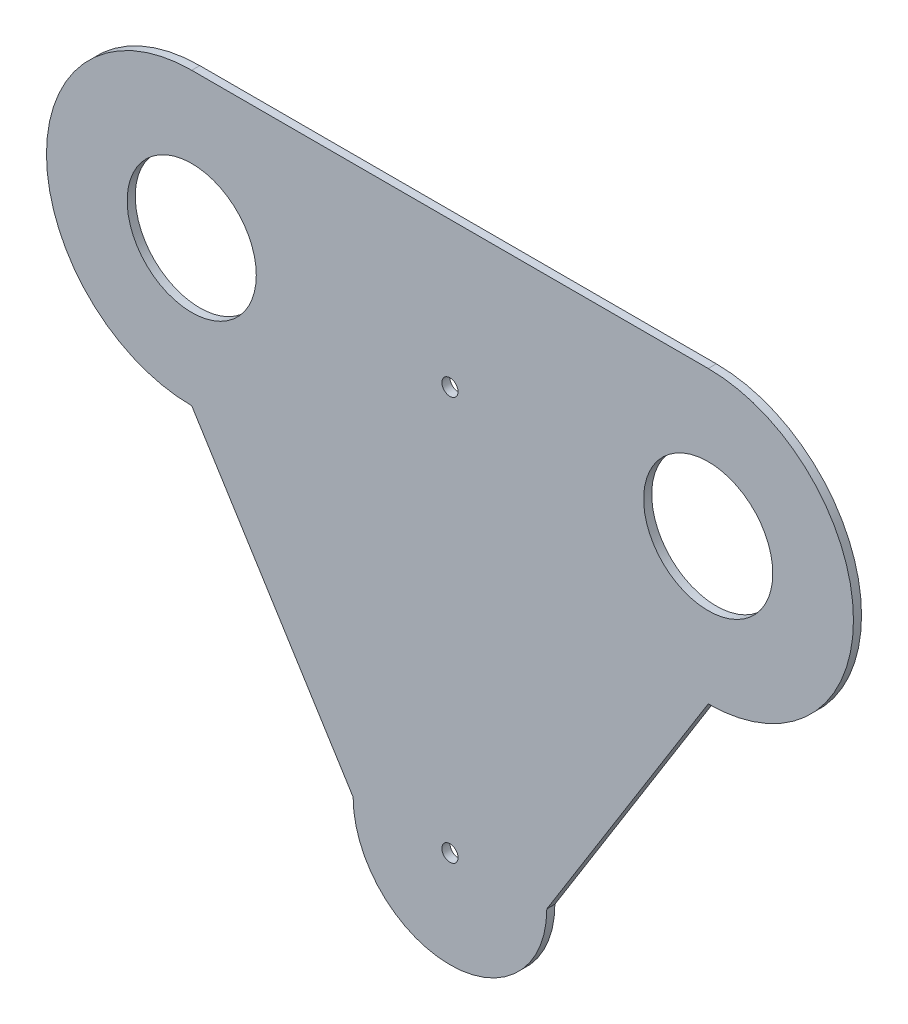
ISO-10303-21;
HEADER;
FILE_DESCRIPTION(('STEP AP214'),'2;1');
FILE_NAME('part.step','',(''),(''),'','','');
FILE_SCHEMA(('AUTOMOTIVE_DESIGN { 1 0 10303 214 1 1 1 1 }'));
ENDSEC;
DATA;
#1=APPLICATION_CONTEXT('core data for automotive mechanical design processes');
#2=APPLICATION_PROTOCOL_DEFINITION('international standard','automotive_design',2000,#1);
#3=PRODUCT_CONTEXT('',#1,'mechanical');
#4=PRODUCT('Part','Part','',(#3));
#5=PRODUCT_RELATED_PRODUCT_CATEGORY('part','',(#4));
#6=PRODUCT_DEFINITION_FORMATION('','',#4);
#7=PRODUCT_DEFINITION_CONTEXT('part definition',#1,'design');
#8=PRODUCT_DEFINITION('design','',#6,#7);
#9=PRODUCT_DEFINITION_SHAPE('','',#8);
#10=(LENGTH_UNIT() NAMED_UNIT(*) SI_UNIT(.MILLI.,.METRE.));
#11=(NAMED_UNIT(*) PLANE_ANGLE_UNIT() SI_UNIT($,.RADIAN.));
#12=(NAMED_UNIT(*) SI_UNIT($,.STERADIAN.) SOLID_ANGLE_UNIT());
#13=UNCERTAINTY_MEASURE_WITH_UNIT(LENGTH_MEASURE(1.E-05),#10,'distance_accuracy_value','');
#14=(GEOMETRIC_REPRESENTATION_CONTEXT(3) GLOBAL_UNCERTAINTY_ASSIGNED_CONTEXT((#13)) GLOBAL_UNIT_ASSIGNED_CONTEXT((#10,
#11,#12)) REPRESENTATION_CONTEXT('',''));
#15=CARTESIAN_POINT('',(0.,0.,0.));
#16=DIRECTION('',(0.,0.,1.));
#17=DIRECTION('',(1.,0.,0.));
#18=AXIS2_PLACEMENT_3D('',#15,#16,#17);
#19=CARTESIAN_POINT('',(0.,-125.,2.5));
#20=DIRECTION('',(0.,0.,-1.));
#21=DIRECTION('',(-1.,0.,0.));
#22=AXIS2_PLACEMENT_3D('',#19,#20,#21);
#23=CYLINDRICAL_SURFACE('',#22,30.);
#24=CARTESIAN_POINT('',(0.,-125.,0.));
#25=DIRECTION('',(0.,0.,1.));
#26=DIRECTION('',(1.,0.,0.));
#27=AXIS2_PLACEMENT_3D('',#24,#25,#26);
#28=CIRCLE('',#27,30.);
#29=CARTESIAN_POINT('',(-30.,-125.,0.));
#30=VERTEX_POINT('',#29);
#31=CARTESIAN_POINT('',(30.0000000000001,-125.,0.));
#32=VERTEX_POINT('',#31);
#33=EDGE_CURVE('E136',#30,#32,#28,.T.);
#34=ORIENTED_EDGE('',*,*,#33,.T.);
#35=DIRECTION('',(0.,0.,-1.));
#36=VECTOR('',#35,1.);
#37=CARTESIAN_POINT('',(30.0000000000001,-125.,2.5));
#38=LINE('',#37,#36);
#39=CARTESIAN_POINT('',(30.0000000000001,-125.,2.5));
#40=VERTEX_POINT('',#39);
#41=EDGE_CURVE('E11',#40,#32,#38,.T.);
#42=ORIENTED_EDGE('',*,*,#41,.F.);
#43=CARTESIAN_POINT('',(0.,-125.,2.5));
#44=DIRECTION('',(0.,0.,1.));
#45=DIRECTION('',(1.,0.,0.));
#46=AXIS2_PLACEMENT_3D('',#43,#44,#45);
#47=CIRCLE('',#46,30.);
#48=CARTESIAN_POINT('',(-30.,-125.,2.5));
#49=VERTEX_POINT('',#48);
#50=EDGE_CURVE('E160',#49,#40,#47,.T.);
#51=ORIENTED_EDGE('',*,*,#50,.F.);
#52=DIRECTION('',(0.,0.,-1.));
#53=VECTOR('',#52,1.);
#54=CARTESIAN_POINT('',(-30.,-125.,2.5));
#55=LINE('',#54,#53);
#56=EDGE_CURVE('E135',#49,#30,#55,.T.);
#57=ORIENTED_EDGE('',*,*,#56,.T.);
#58=EDGE_LOOP('',(#34,#42,#51,#57));
#59=FACE_BOUND('',#58,.T.);
#60=ADVANCED_FACE('F41',(#59),#23,.T.);
#61=CARTESIAN_POINT('',(77.7528089887641,-48.5955056179775,2.5));
#62=DIRECTION('',(-0.847998304005088,0.52999894000318,0.));
#63=DIRECTION('',(-0.52999894000318,-0.847998304005088,0.));
#64=AXIS2_PLACEMENT_3D('',#61,#62,#63);
#65=PLANE('',#64);
#66=DIRECTION('',(0.52999894000318,0.847998304005088,0.));
#67=VECTOR('',#66,1.);
#68=CARTESIAN_POINT('',(77.7528089887641,-48.5955056179775,0.));
#69=LINE('',#68,#67);
#70=CARTESIAN_POINT('',(80.,-45.,0.));
#71=VERTEX_POINT('',#70);
#72=EDGE_CURVE('E139',#32,#71,#69,.T.);
#73=ORIENTED_EDGE('',*,*,#72,.T.);
#74=DIRECTION('',(0.,0.,-1.));
#75=VECTOR('',#74,1.);
#76=CARTESIAN_POINT('',(80.,-45.,2.5));
#77=LINE('',#76,#75);
#78=CARTESIAN_POINT('',(80.,-45.,2.5));
#79=VERTEX_POINT('',#78);
#80=EDGE_CURVE('E49',#79,#71,#77,.T.);
#81=ORIENTED_EDGE('',*,*,#80,.F.);
#82=DIRECTION('',(0.52999894000318,0.847998304005088,0.));
#83=VECTOR('',#82,1.);
#84=CARTESIAN_POINT('',(77.7528089887641,-48.5955056179775,2.5));
#85=LINE('',#84,#83);
#86=EDGE_CURVE('E90',#40,#79,#85,.T.);
#87=ORIENTED_EDGE('',*,*,#86,.F.);
#88=ORIENTED_EDGE('',*,*,#41,.T.);
#89=EDGE_LOOP('',(#73,#81,#87,#88));
#90=FACE_BOUND('',#89,.T.);
#91=ADVANCED_FACE('F190',(#90),#65,.F.);
#92=CARTESIAN_POINT('',(80.,0.,2.5));
#93=DIRECTION('',(0.,0.,-1.));
#94=DIRECTION('',(-1.,0.,0.));
#95=AXIS2_PLACEMENT_3D('',#92,#93,#94);
#96=CYLINDRICAL_SURFACE('',#95,45.);
#97=CARTESIAN_POINT('',(80.,0.,0.));
#98=DIRECTION('',(0.,0.,1.));
#99=DIRECTION('',(1.,0.,0.));
#100=AXIS2_PLACEMENT_3D('',#97,#98,#99);
#101=CIRCLE('',#100,45.);
#102=CARTESIAN_POINT('',(80.,45.0000000000001,0.));
#103=VERTEX_POINT('',#102);
#104=EDGE_CURVE('E141',#71,#103,#101,.T.);
#105=ORIENTED_EDGE('',*,*,#104,.T.);
#106=DIRECTION('',(0.,0.,-1.));
#107=VECTOR('',#106,1.);
#108=CARTESIAN_POINT('',(80.,45.0000000000001,2.5));
#109=LINE('',#108,#107);
#110=CARTESIAN_POINT('',(80.,45.0000000000001,2.5));
#111=VERTEX_POINT('',#110);
#112=EDGE_CURVE('E109',#111,#103,#109,.T.);
#113=ORIENTED_EDGE('',*,*,#112,.F.);
#114=CARTESIAN_POINT('',(80.,0.,2.5));
#115=DIRECTION('',(0.,0.,1.));
#116=DIRECTION('',(1.,0.,0.));
#117=AXIS2_PLACEMENT_3D('',#114,#115,#116);
#118=CIRCLE('',#117,45.);
#119=EDGE_CURVE('E115',#79,#111,#118,.T.);
#120=ORIENTED_EDGE('',*,*,#119,.F.);
#121=ORIENTED_EDGE('',*,*,#80,.T.);
#122=EDGE_LOOP('',(#105,#113,#120,#121));
#123=FACE_BOUND('',#122,.T.);
#124=ADVANCED_FACE('F166',(#123),#96,.T.);
#125=CARTESIAN_POINT('',(0.,45.,2.5));
#126=DIRECTION('',(0.,1.,0.));
#127=DIRECTION('',(-1.,0.,0.));
#128=AXIS2_PLACEMENT_3D('',#125,#126,#127);
#129=PLANE('',#128);
#130=DIRECTION('',(1.,0.,0.));
#131=VECTOR('',#130,1.);
#132=CARTESIAN_POINT('',(0.,45.,0.));
#133=LINE('',#132,#131);
#134=CARTESIAN_POINT('',(-80.,45.,0.));
#135=VERTEX_POINT('',#134);
#136=EDGE_CURVE('E104',#135,#103,#133,.T.);
#137=ORIENTED_EDGE('',*,*,#136,.F.);
#138=DIRECTION('',(0.,0.,-1.));
#139=VECTOR('',#138,1.);
#140=CARTESIAN_POINT('',(-80.,45.,2.5));
#141=LINE('',#140,#139);
#142=CARTESIAN_POINT('',(-80.,45.,2.5));
#143=VERTEX_POINT('',#142);
#144=EDGE_CURVE('E99',#143,#135,#141,.T.);
#145=ORIENTED_EDGE('',*,*,#144,.F.);
#146=DIRECTION('',(1.,0.,0.));
#147=VECTOR('',#146,1.);
#148=CARTESIAN_POINT('',(0.,45.,2.5));
#149=LINE('',#148,#147);
#150=EDGE_CURVE('E102',#143,#111,#149,.T.);
#151=ORIENTED_EDGE('',*,*,#150,.T.);
#152=ORIENTED_EDGE('',*,*,#112,.T.);
#153=EDGE_LOOP('',(#137,#145,#151,#152));
#154=FACE_BOUND('',#153,.T.);
#155=ADVANCED_FACE('F101',(#154),#129,.T.);
#156=CARTESIAN_POINT('',(-80.,0.,2.5));
#157=DIRECTION('',(0.,0.,-1.));
#158=DIRECTION('',(-1.,0.,0.));
#159=AXIS2_PLACEMENT_3D('',#156,#157,#158);
#160=CYLINDRICAL_SURFACE('',#159,45.);
#161=CARTESIAN_POINT('',(-80.,0.,0.));
#162=DIRECTION('',(0.,0.,1.));
#163=DIRECTION('',(1.,0.,0.));
#164=AXIS2_PLACEMENT_3D('',#161,#162,#163);
#165=CIRCLE('',#164,45.);
#166=CARTESIAN_POINT('',(-80.,-45.,0.));
#167=VERTEX_POINT('',#166);
#168=EDGE_CURVE('E145',#167,#135,#165,.F.);
#169=ORIENTED_EDGE('',*,*,#168,.F.);
#170=DIRECTION('',(0.,0.,-1.));
#171=VECTOR('',#170,1.);
#172=CARTESIAN_POINT('',(-80.,-45.,2.5));
#173=LINE('',#172,#171);
#174=CARTESIAN_POINT('',(-80.,-45.,2.5));
#175=VERTEX_POINT('',#174);
#176=EDGE_CURVE('E79',#175,#167,#173,.T.);
#177=ORIENTED_EDGE('',*,*,#176,.F.);
#178=CARTESIAN_POINT('',(-80.,0.,2.5));
#179=DIRECTION('',(0.,0.,1.));
#180=DIRECTION('',(1.,0.,0.));
#181=AXIS2_PLACEMENT_3D('',#178,#179,#180);
#182=CIRCLE('',#181,45.);
#183=EDGE_CURVE('E113',#175,#143,#182,.F.);
#184=ORIENTED_EDGE('',*,*,#183,.T.);
#185=ORIENTED_EDGE('',*,*,#144,.T.);
#186=EDGE_LOOP('',(#169,#177,#184,#185));
#187=FACE_BOUND('',#186,.T.);
#188=ADVANCED_FACE('F118',(#187),#160,.T.);
#189=CARTESIAN_POINT('',(80.,0.,2.5));
#190=DIRECTION('',(0.,0.,-1.));
#191=DIRECTION('',(-1.,0.,0.));
#192=AXIS2_PLACEMENT_3D('',#189,#190,#191);
#193=CYLINDRICAL_SURFACE('',#192,20.);
#194=CARTESIAN_POINT('',(80.,0.,2.5));
#195=DIRECTION('',(0.,0.,1.));
#196=DIRECTION('',(1.,0.,0.));
#197=AXIS2_PLACEMENT_3D('',#194,#195,#196);
#198=CIRCLE('',#197,20.);
#199=CARTESIAN_POINT('',(100.,0.,2.5));
#200=VERTEX_POINT('',#199);
#201=EDGE_CURVE('E129',#200,#200,#198,.T.);
#202=ORIENTED_EDGE('',*,*,#201,.T.);
#203=EDGE_LOOP('',(#202));
#204=FACE_BOUND('',#203,.T.);
#205=CARTESIAN_POINT('',(80.,0.,0.));
#206=DIRECTION('',(0.,0.,1.));
#207=DIRECTION('',(1.,0.,0.));
#208=AXIS2_PLACEMENT_3D('',#205,#206,#207);
#209=CIRCLE('',#208,20.);
#210=CARTESIAN_POINT('',(100.,0.,0.));
#211=VERTEX_POINT('',#210);
#212=EDGE_CURVE('E154',#211,#211,#209,.T.);
#213=ORIENTED_EDGE('',*,*,#212,.F.);
#214=EDGE_LOOP('',(#213));
#215=FACE_BOUND('',#214,.T.);
#216=ADVANCED_FACE('F201',(#204,#215),#193,.F.);
#217=CARTESIAN_POINT('',(0.,0.,2.5));
#218=DIRECTION('',(0.,0.,-1.));
#219=DIRECTION('',(-1.,0.,0.));
#220=AXIS2_PLACEMENT_3D('',#217,#218,#219);
#221=CYLINDRICAL_SURFACE('',#220,2.5);
#222=CARTESIAN_POINT('',(0.,0.,2.5));
#223=DIRECTION('',(0.,0.,1.));
#224=DIRECTION('',(1.,0.,0.));
#225=AXIS2_PLACEMENT_3D('',#222,#223,#224);
#226=CIRCLE('',#225,2.5);
#227=CARTESIAN_POINT('',(2.5,0.,2.5));
#228=VERTEX_POINT('',#227);
#229=EDGE_CURVE('E126',#228,#228,#226,.T.);
#230=ORIENTED_EDGE('',*,*,#229,.T.);
#231=EDGE_LOOP('',(#230));
#232=FACE_BOUND('',#231,.T.);
#233=CARTESIAN_POINT('',(0.,0.,0.));
#234=DIRECTION('',(0.,0.,1.));
#235=DIRECTION('',(1.,0.,0.));
#236=AXIS2_PLACEMENT_3D('',#233,#234,#235);
#237=CIRCLE('',#236,2.5);
#238=CARTESIAN_POINT('',(2.5,0.,0.));
#239=VERTEX_POINT('',#238);
#240=EDGE_CURVE('E151',#239,#239,#237,.T.);
#241=ORIENTED_EDGE('',*,*,#240,.F.);
#242=EDGE_LOOP('',(#241));
#243=FACE_BOUND('',#242,.T.);
#244=ADVANCED_FACE('F185',(#232,#243),#221,.F.);
#245=CARTESIAN_POINT('',(0.,-125.,2.5));
#246=DIRECTION('',(0.,0.,-1.));
#247=DIRECTION('',(-1.,0.,0.));
#248=AXIS2_PLACEMENT_3D('',#245,#246,#247);
#249=CYLINDRICAL_SURFACE('',#248,2.5);
#250=CARTESIAN_POINT('',(0.,-125.,2.5));
#251=DIRECTION('',(0.,0.,1.));
#252=DIRECTION('',(1.,0.,0.));
#253=AXIS2_PLACEMENT_3D('',#250,#251,#252);
#254=CIRCLE('',#253,2.5);
#255=CARTESIAN_POINT('',(2.50000000000002,-125.,2.5));
#256=VERTEX_POINT('',#255);
#257=EDGE_CURVE('E120',#256,#256,#254,.T.);
#258=ORIENTED_EDGE('',*,*,#257,.T.);
#259=EDGE_LOOP('',(#258));
#260=FACE_BOUND('',#259,.T.);
#261=CARTESIAN_POINT('',(0.,-125.,0.));
#262=DIRECTION('',(0.,0.,1.));
#263=DIRECTION('',(1.,0.,0.));
#264=AXIS2_PLACEMENT_3D('',#261,#262,#263);
#265=CIRCLE('',#264,2.5);
#266=CARTESIAN_POINT('',(2.50000000000002,-125.,0.));
#267=VERTEX_POINT('',#266);
#268=EDGE_CURVE('E148',#267,#267,#265,.T.);
#269=ORIENTED_EDGE('',*,*,#268,.F.);
#270=EDGE_LOOP('',(#269));
#271=FACE_BOUND('',#270,.T.);
#272=ADVANCED_FACE('F177',(#260,#271),#249,.F.);
#273=CARTESIAN_POINT('',(-77.752808988764,-48.5955056179775,2.5));
#274=DIRECTION('',(0.847998304005088,0.52999894000318,0.));
#275=DIRECTION('',(-0.52999894000318,0.847998304005088,0.));
#276=AXIS2_PLACEMENT_3D('',#273,#274,#275);
#277=PLANE('',#276);
#278=DIRECTION('',(0.52999894000318,-0.847998304005088,0.));
#279=VECTOR('',#278,1.);
#280=CARTESIAN_POINT('',(-77.752808988764,-48.5955056179775,0.));
#281=LINE('',#280,#279);
#282=EDGE_CURVE('E82',#167,#30,#281,.T.);
#283=ORIENTED_EDGE('',*,*,#282,.T.);
#284=ORIENTED_EDGE('',*,*,#56,.F.);
#285=DIRECTION('',(0.52999894000318,-0.847998304005088,0.));
#286=VECTOR('',#285,1.);
#287=CARTESIAN_POINT('',(-77.752808988764,-48.5955056179775,2.5));
#288=LINE('',#287,#286);
#289=EDGE_CURVE('E57',#175,#49,#288,.T.);
#290=ORIENTED_EDGE('',*,*,#289,.F.);
#291=ORIENTED_EDGE('',*,*,#176,.T.);
#292=EDGE_LOOP('',(#283,#284,#290,#291));
#293=FACE_BOUND('',#292,.T.);
#294=ADVANCED_FACE('F174',(#293),#277,.F.);
#295=CARTESIAN_POINT('',(-80.,0.,2.5));
#296=DIRECTION('',(0.,0.,-1.));
#297=DIRECTION('',(-1.,0.,0.));
#298=AXIS2_PLACEMENT_3D('',#295,#296,#297);
#299=CYLINDRICAL_SURFACE('',#298,20.);
#300=CARTESIAN_POINT('',(-80.,0.,2.5));
#301=DIRECTION('',(0.,0.,1.));
#302=DIRECTION('',(1.,0.,0.));
#303=AXIS2_PLACEMENT_3D('',#300,#301,#302);
#304=CIRCLE('',#303,20.);
#305=CARTESIAN_POINT('',(-60.,0.,2.5));
#306=VERTEX_POINT('',#305);
#307=EDGE_CURVE('E132',#306,#306,#304,.T.);
#308=ORIENTED_EDGE('',*,*,#307,.T.);
#309=EDGE_LOOP('',(#308));
#310=FACE_BOUND('',#309,.T.);
#311=CARTESIAN_POINT('',(-80.,0.,0.));
#312=DIRECTION('',(0.,0.,1.));
#313=DIRECTION('',(1.,0.,0.));
#314=AXIS2_PLACEMENT_3D('',#311,#312,#313);
#315=CIRCLE('',#314,20.);
#316=CARTESIAN_POINT('',(-60.,0.,0.));
#317=VERTEX_POINT('',#316);
#318=EDGE_CURVE('E157',#317,#317,#315,.T.);
#319=ORIENTED_EDGE('',*,*,#318,.F.);
#320=EDGE_LOOP('',(#319));
#321=FACE_BOUND('',#320,.T.);
#322=ADVANCED_FACE('F176',(#310,#321),#299,.F.);
#323=CARTESIAN_POINT('',(0.,0.,2.5));
#324=DIRECTION('',(0.,0.,1.));
#325=DIRECTION('',(1.,0.,0.));
#326=AXIS2_PLACEMENT_3D('',#323,#324,#325);
#327=PLANE('',#326);
#328=ORIENTED_EDGE('',*,*,#50,.T.);
#329=ORIENTED_EDGE('',*,*,#86,.T.);
#330=ORIENTED_EDGE('',*,*,#119,.T.);
#331=ORIENTED_EDGE('',*,*,#150,.F.);
#332=ORIENTED_EDGE('',*,*,#183,.F.);
#333=ORIENTED_EDGE('',*,*,#289,.T.);
#334=EDGE_LOOP('',(#328,#329,#330,#331,#332,#333));
#335=FACE_BOUND('',#334,.T.);
#336=ORIENTED_EDGE('',*,*,#257,.F.);
#337=EDGE_LOOP('',(#336));
#338=FACE_BOUND('',#337,.T.);
#339=ORIENTED_EDGE('',*,*,#229,.F.);
#340=EDGE_LOOP('',(#339));
#341=FACE_BOUND('',#340,.T.);
#342=ORIENTED_EDGE('',*,*,#201,.F.);
#343=EDGE_LOOP('',(#342));
#344=FACE_BOUND('',#343,.T.);
#345=ORIENTED_EDGE('',*,*,#307,.F.);
#346=EDGE_LOOP('',(#345));
#347=FACE_BOUND('',#346,.T.);
#348=ADVANCED_FACE('F111',(#335,#338,#341,#344,#347),#327,.T.);
#349=CARTESIAN_POINT('',(0.,0.,0.));
#350=DIRECTION('',(0.,0.,1.));
#351=DIRECTION('',(1.,0.,0.));
#352=AXIS2_PLACEMENT_3D('',#349,#350,#351);
#353=PLANE('',#352);
#354=ORIENTED_EDGE('',*,*,#33,.F.);
#355=ORIENTED_EDGE('',*,*,#282,.F.);
#356=ORIENTED_EDGE('',*,*,#168,.T.);
#357=ORIENTED_EDGE('',*,*,#136,.T.);
#358=ORIENTED_EDGE('',*,*,#104,.F.);
#359=ORIENTED_EDGE('',*,*,#72,.F.);
#360=EDGE_LOOP('',(#354,#355,#356,#357,#358,#359));
#361=FACE_BOUND('',#360,.T.);
#362=ORIENTED_EDGE('',*,*,#268,.T.);
#363=EDGE_LOOP('',(#362));
#364=FACE_BOUND('',#363,.T.);
#365=ORIENTED_EDGE('',*,*,#240,.T.);
#366=EDGE_LOOP('',(#365));
#367=FACE_BOUND('',#366,.T.);
#368=ORIENTED_EDGE('',*,*,#212,.T.);
#369=EDGE_LOOP('',(#368));
#370=FACE_BOUND('',#369,.T.);
#371=ORIENTED_EDGE('',*,*,#318,.T.);
#372=EDGE_LOOP('',(#371));
#373=FACE_BOUND('',#372,.T.);
#374=ADVANCED_FACE('F169',(#361,#364,#367,#370,#373),#353,.F.);
#375=CLOSED_SHELL('',(#60,#91,#124,#155,#188,#216,#244,#272,#294,#322,#348,#374));
#376=MANIFOLD_SOLID_BREP('B2',#375);
#377=ADVANCED_BREP_SHAPE_REPRESENTATION('',(#18,#376),#14);
#378=SHAPE_DEFINITION_REPRESENTATION(#9,#377);
ENDSEC;
END-ISO-10303-21;
